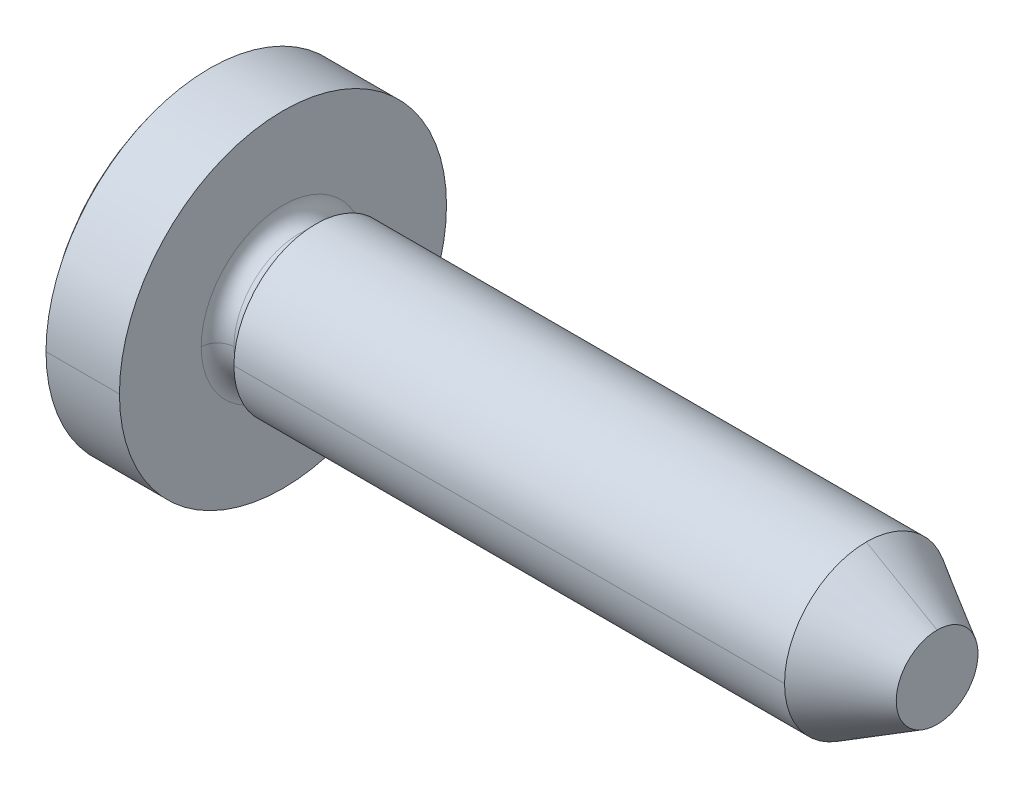
ISO-10303-21;
HEADER;
FILE_DESCRIPTION(('STEP AP214'),'2;1');
FILE_NAME('part.step','',(''),(''),'','','');
FILE_SCHEMA(('AUTOMOTIVE_DESIGN { 1 0 10303 214 1 1 1 1 }'));
ENDSEC;
DATA;
#1=APPLICATION_CONTEXT('core data for automotive mechanical design processes');
#2=APPLICATION_PROTOCOL_DEFINITION('international standard','automotive_design',2000,#1);
#3=PRODUCT_CONTEXT('',#1,'mechanical');
#4=PRODUCT('Part','Part','',(#3));
#5=PRODUCT_RELATED_PRODUCT_CATEGORY('part','',(#4));
#6=PRODUCT_DEFINITION_FORMATION('','',#4);
#7=PRODUCT_DEFINITION_CONTEXT('part definition',#1,'design');
#8=PRODUCT_DEFINITION('design','',#6,#7);
#9=PRODUCT_DEFINITION_SHAPE('','',#8);
#10=(LENGTH_UNIT() NAMED_UNIT(*) SI_UNIT(.MILLI.,.METRE.));
#11=(NAMED_UNIT(*) PLANE_ANGLE_UNIT() SI_UNIT($,.RADIAN.));
#12=(NAMED_UNIT(*) SI_UNIT($,.STERADIAN.) SOLID_ANGLE_UNIT());
#13=UNCERTAINTY_MEASURE_WITH_UNIT(LENGTH_MEASURE(1.E-05),#10,'distance_accuracy_value','');
#14=(GEOMETRIC_REPRESENTATION_CONTEXT(3) GLOBAL_UNCERTAINTY_ASSIGNED_CONTEXT((#13)) GLOBAL_UNIT_ASSIGNED_CONTEXT((#10,
#11,#12)) REPRESENTATION_CONTEXT('',''));
#15=CARTESIAN_POINT('',(0.,0.,0.));
#16=DIRECTION('',(0.,0.,1.));
#17=DIRECTION('',(1.,0.,0.));
#18=AXIS2_PLACEMENT_3D('',#15,#16,#17);
#19=CARTESIAN_POINT('',(1.8,0.,0.));
#20=DIRECTION('',(1.,0.,0.));
#21=DIRECTION('',(0.,0.,-1.));
#22=AXIS2_PLACEMENT_3D('',#19,#20,#21);
#23=TOROIDAL_SURFACE('',#22,0.999999999999981,0.2);
#24=CARTESIAN_POINT('',(1.8,0.,-0.999999999999981));
#25=DIRECTION('',(0.,-1.,0.));
#26=DIRECTION('',(0.,0.,-1.));
#27=AXIS2_PLACEMENT_3D('',#24,#25,#26);
#28=CIRCLE('',#27,0.2);
#29=CARTESIAN_POINT('',(2.,0.,-0.999999999999981));
#30=VERTEX_POINT('',#29);
#31=CARTESIAN_POINT('',(1.8,0.,-0.799999999999981));
#32=VERTEX_POINT('',#31);
#33=EDGE_CURVE('E11',#30,#32,#28,.T.);
#34=ORIENTED_EDGE('',*,*,#33,.T.);
#35=CARTESIAN_POINT('',(1.8,0.,0.));
#36=DIRECTION('',(1.,0.,0.));
#37=DIRECTION('',(0.,0.,-1.));
#38=AXIS2_PLACEMENT_3D('',#35,#36,#37);
#39=CIRCLE('',#38,0.799999999999981);
#40=CARTESIAN_POINT('',(1.8,0.,0.799999999999981));
#41=VERTEX_POINT('',#40);
#42=EDGE_CURVE('E27',#32,#41,#39,.T.);
#43=ORIENTED_EDGE('',*,*,#42,.T.);
#44=CARTESIAN_POINT('',(1.8,0.,0.999999999999981));
#45=DIRECTION('',(0.,1.,0.));
#46=DIRECTION('',(0.,0.,1.));
#47=AXIS2_PLACEMENT_3D('',#44,#45,#46);
#48=CIRCLE('',#47,0.2);
#49=CARTESIAN_POINT('',(2.,0.,0.999999999999981));
#50=VERTEX_POINT('',#49);
#51=EDGE_CURVE('E372',#50,#41,#48,.T.);
#52=ORIENTED_EDGE('',*,*,#51,.F.);
#53=CARTESIAN_POINT('',(2.,0.,0.));
#54=DIRECTION('',(1.,0.,0.));
#55=DIRECTION('',(0.,0.,-1.));
#56=AXIS2_PLACEMENT_3D('',#53,#54,#55);
#57=CIRCLE('',#56,0.999999999999981);
#58=EDGE_CURVE('E326',#30,#50,#57,.T.);
#59=ORIENTED_EDGE('',*,*,#58,.F.);
#60=EDGE_LOOP('',(#34,#43,#52,#59));
#61=FACE_BOUND('',#60,.T.);
#62=ADVANCED_FACE('F16',(#61),#23,.F.);
#63=CARTESIAN_POINT('',(1.8,0.,0.));
#64=DIRECTION('',(1.,0.,0.));
#65=DIRECTION('',(0.,0.,-1.));
#66=AXIS2_PLACEMENT_3D('',#63,#64,#65);
#67=TOROIDAL_SURFACE('',#66,0.999999999999981,0.2);
#68=ORIENTED_EDGE('',*,*,#51,.T.);
#69=CARTESIAN_POINT('',(1.8,0.,0.));
#70=DIRECTION('',(1.,0.,0.));
#71=DIRECTION('',(0.,0.,-1.));
#72=AXIS2_PLACEMENT_3D('',#69,#70,#71);
#73=CIRCLE('',#72,0.799999999999981);
#74=EDGE_CURVE('E42',#41,#32,#73,.T.);
#75=ORIENTED_EDGE('',*,*,#74,.T.);
#76=ORIENTED_EDGE('',*,*,#33,.F.);
#77=CARTESIAN_POINT('',(2.,0.,0.));
#78=DIRECTION('',(1.,0.,0.));
#79=DIRECTION('',(0.,0.,-1.));
#80=AXIS2_PLACEMENT_3D('',#77,#78,#79);
#81=CIRCLE('',#80,0.999999999999981);
#82=EDGE_CURVE('E291',#50,#30,#81,.T.);
#83=ORIENTED_EDGE('',*,*,#82,.F.);
#84=EDGE_LOOP('',(#68,#75,#76,#83));
#85=FACE_BOUND('',#84,.T.);
#86=ADVANCED_FACE('F502',(#85),#67,.F.);
#87=CARTESIAN_POINT('',(-96.3851955307263,0.,0.));
#88=DIRECTION('',(-1.,0.,0.));
#89=DIRECTION('',(0.,0.,1.));
#90=AXIS2_PLACEMENT_3D('',#87,#88,#89);
#91=CYLINDRICAL_SURFACE('',#90,0.999999999999984);
#92=CARTESIAN_POINT('',(8.73397459621555,0.,0.));
#93=DIRECTION('',(1.,0.,0.));
#94=DIRECTION('',(0.,1.,0.));
#95=AXIS2_PLACEMENT_3D('',#92,#93,#94);
#96=CIRCLE('',#95,1.);
#97=CARTESIAN_POINT('',(8.73397459621555,0.,-1.));
#98=VERTEX_POINT('',#97);
#99=CARTESIAN_POINT('',(8.73397459621555,1.,0.));
#100=VERTEX_POINT('',#99);
#101=EDGE_CURVE('E290',#98,#100,#96,.T.);
#102=ORIENTED_EDGE('',*,*,#101,.F.);
#103=DIRECTION('',(-1.,0.,0.));
#104=VECTOR('',#103,1.);
#105=CARTESIAN_POINT('',(-96.3851955307263,0.,-0.999999999999984));
#106=LINE('',#105,#104);
#107=EDGE_CURVE('E330',#98,#30,#106,.T.);
#108=ORIENTED_EDGE('',*,*,#107,.T.);
#109=ORIENTED_EDGE('',*,*,#58,.T.);
#110=DIRECTION('',(-1.,0.,0.));
#111=VECTOR('',#110,1.);
#112=CARTESIAN_POINT('',(-96.3851955307263,0.,0.999999999999984));
#113=LINE('',#112,#111);
#114=CARTESIAN_POINT('',(8.73397459621555,0.,1.));
#115=VERTEX_POINT('',#114);
#116=EDGE_CURVE('E286',#115,#50,#113,.T.);
#117=ORIENTED_EDGE('',*,*,#116,.F.);
#118=CARTESIAN_POINT('',(8.73397459621555,0.,0.));
#119=DIRECTION('',(1.,0.,0.));
#120=DIRECTION('',(0.,1.,0.));
#121=AXIS2_PLACEMENT_3D('',#118,#119,#120);
#122=CIRCLE('',#121,1.);
#123=EDGE_CURVE('E438',#100,#115,#122,.T.);
#124=ORIENTED_EDGE('',*,*,#123,.F.);
#125=EDGE_LOOP('',(#102,#108,#109,#117,#124));
#126=FACE_BOUND('',#125,.T.);
#127=ADVANCED_FACE('F483',(#126),#91,.T.);
#128=CARTESIAN_POINT('',(9.6,0.,0.));
#129=DIRECTION('',(-1.,0.,0.));
#130=DIRECTION('',(0.,-1.,0.));
#131=AXIS2_PLACEMENT_3D('',#128,#129,#130);
#132=CONICAL_SURFACE('',#131,0.5,0.523598775598297);
#133=CARTESIAN_POINT('',(9.6,0.,0.));
#134=DIRECTION('',(1.,0.,0.));
#135=DIRECTION('',(0.,1.,0.));
#136=AXIS2_PLACEMENT_3D('',#133,#134,#135);
#137=CIRCLE('',#136,0.5);
#138=CARTESIAN_POINT('',(9.6,0.5,0.));
#139=VERTEX_POINT('',#138);
#140=CARTESIAN_POINT('',(9.6,-0.5,0.));
#141=VERTEX_POINT('',#140);
#142=EDGE_CURVE('E369',#139,#141,#137,.T.);
#143=ORIENTED_EDGE('',*,*,#142,.F.);
#144=DIRECTION('',(-0.866025403784442,0.5,0.));
#145=VECTOR('',#144,1.);
#146=CARTESIAN_POINT('',(9.6,0.5,0.));
#147=LINE('',#146,#145);
#148=EDGE_CURVE('E331',#139,#100,#147,.T.);
#149=ORIENTED_EDGE('',*,*,#148,.T.);
#150=ORIENTED_EDGE('',*,*,#123,.T.);
#151=CARTESIAN_POINT('',(8.73397459621555,0.,0.));
#152=DIRECTION('',(1.,0.,0.));
#153=DIRECTION('',(0.,1.,0.));
#154=AXIS2_PLACEMENT_3D('',#151,#152,#153);
#155=CIRCLE('',#154,1.);
#156=CARTESIAN_POINT('',(8.73397459621555,-1.,0.));
#157=VERTEX_POINT('',#156);
#158=EDGE_CURVE('E434',#115,#157,#155,.T.);
#159=ORIENTED_EDGE('',*,*,#158,.T.);
#160=DIRECTION('',(-0.866025403784441,-0.5,0.));
#161=VECTOR('',#160,1.);
#162=CARTESIAN_POINT('',(9.6,-0.5,0.));
#163=LINE('',#162,#161);
#164=EDGE_CURVE('E386',#141,#157,#163,.T.);
#165=ORIENTED_EDGE('',*,*,#164,.F.);
#166=EDGE_LOOP('',(#143,#149,#150,#159,#165));
#167=FACE_BOUND('',#166,.T.);
#168=ADVANCED_FACE('F476',(#167),#132,.T.);
#169=CARTESIAN_POINT('',(1.8,0.,0.));
#170=DIRECTION('',(1.,0.,0.));
#171=DIRECTION('',(0.,0.,-1.));
#172=AXIS2_PLACEMENT_3D('',#169,#170,#171);
#173=TOROIDAL_SURFACE('',#172,0.999999999999981,0.2);
#174=ORIENTED_EDGE('',*,*,#74,.F.);
#175=CARTESIAN_POINT('',(1.8,0.,0.999999999999981));
#176=DIRECTION('',(0.,1.,0.));
#177=DIRECTION('',(0.,0.,1.));
#178=AXIS2_PLACEMENT_3D('',#175,#176,#177);
#179=CIRCLE('',#178,0.2);
#180=CARTESIAN_POINT('',(1.6,0.,0.999999999999981));
#181=VERTEX_POINT('',#180);
#182=EDGE_CURVE('E390',#41,#181,#179,.T.);
#183=ORIENTED_EDGE('',*,*,#182,.T.);
#184=CARTESIAN_POINT('',(1.6,0.,0.));
#185=DIRECTION('',(1.,0.,0.));
#186=DIRECTION('',(0.,0.,-1.));
#187=AXIS2_PLACEMENT_3D('',#184,#185,#186);
#188=CIRCLE('',#187,0.999999999999981);
#189=CARTESIAN_POINT('',(1.6,0.,-0.999999999999981));
#190=VERTEX_POINT('',#189);
#191=EDGE_CURVE('E274',#181,#190,#188,.T.);
#192=ORIENTED_EDGE('',*,*,#191,.T.);
#193=CARTESIAN_POINT('',(1.8,0.,-0.999999999999981));
#194=DIRECTION('',(0.,-1.,0.));
#195=DIRECTION('',(0.,0.,-1.));
#196=AXIS2_PLACEMENT_3D('',#193,#194,#195);
#197=CIRCLE('',#196,0.2);
#198=EDGE_CURVE('E296',#32,#190,#197,.T.);
#199=ORIENTED_EDGE('',*,*,#198,.F.);
#200=EDGE_LOOP('',(#174,#183,#192,#199));
#201=FACE_BOUND('',#200,.T.);
#202=ADVANCED_FACE('F680',(#201),#173,.F.);
#203=CARTESIAN_POINT('',(-96.3851955307263,0.,0.));
#204=DIRECTION('',(-1.,0.,0.));
#205=DIRECTION('',(0.,0.,1.));
#206=AXIS2_PLACEMENT_3D('',#203,#204,#205);
#207=CYLINDRICAL_SURFACE('',#206,2.);
#208=CARTESIAN_POINT('',(1.6,0.,0.));
#209=DIRECTION('',(-1.,0.,0.));
#210=DIRECTION('',(0.,0.,1.));
#211=AXIS2_PLACEMENT_3D('',#208,#209,#210);
#212=CIRCLE('',#211,2.);
#213=CARTESIAN_POINT('',(1.6,0.,2.));
#214=VERTEX_POINT('',#213);
#215=CARTESIAN_POINT('',(1.6,0.,-2.));
#216=VERTEX_POINT('',#215);
#217=EDGE_CURVE('E271',#214,#216,#212,.T.);
#218=ORIENTED_EDGE('',*,*,#217,.T.);
#219=DIRECTION('',(-1.,0.,0.));
#220=VECTOR('',#219,1.);
#221=CARTESIAN_POINT('',(-96.3851955307263,0.,-2.));
#222=LINE('',#221,#220);
#223=CARTESIAN_POINT('',(0.702000800640645,0.,-2.));
#224=VERTEX_POINT('',#223);
#225=EDGE_CURVE('E275',#216,#224,#222,.T.);
#226=ORIENTED_EDGE('',*,*,#225,.T.);
#227=CARTESIAN_POINT('',(0.702000800640645,0.,0.));
#228=DIRECTION('',(-1.,0.,0.));
#229=DIRECTION('',(0.,0.,1.));
#230=AXIS2_PLACEMENT_3D('',#227,#228,#229);
#231=CIRCLE('',#230,2.);
#232=CARTESIAN_POINT('',(0.702000800640646,2.,0.));
#233=VERTEX_POINT('',#232);
#234=EDGE_CURVE('E158',#233,#224,#231,.T.);
#235=ORIENTED_EDGE('',*,*,#234,.F.);
#236=CARTESIAN_POINT('',(0.702000800640645,0.,0.));
#237=DIRECTION('',(-1.,0.,0.));
#238=DIRECTION('',(0.,0.,1.));
#239=AXIS2_PLACEMENT_3D('',#236,#237,#238);
#240=CIRCLE('',#239,2.);
#241=CARTESIAN_POINT('',(0.702000800640645,0.,2.));
#242=VERTEX_POINT('',#241);
#243=EDGE_CURVE('E172',#242,#233,#240,.T.);
#244=ORIENTED_EDGE('',*,*,#243,.F.);
#245=DIRECTION('',(-1.,0.,0.));
#246=VECTOR('',#245,1.);
#247=CARTESIAN_POINT('',(-96.3851955307263,0.,2.));
#248=LINE('',#247,#246);
#249=EDGE_CURVE('E303',#214,#242,#248,.T.);
#250=ORIENTED_EDGE('',*,*,#249,.F.);
#251=EDGE_LOOP('',(#218,#226,#235,#244,#250));
#252=FACE_BOUND('',#251,.T.);
#253=ADVANCED_FACE('F894',(#252),#207,.T.);
#254=CARTESIAN_POINT('',(3.2,0.,0.));
#255=DIRECTION('',(0.,0.,-1.));
#256=DIRECTION('',(0.,1.,0.));
#257=AXIS2_PLACEMENT_3D('',#254,#255,#256);
#258=SPHERICAL_SURFACE('',#257,3.2);
#259=ORIENTED_EDGE('',*,*,#234,.T.);
#260=CARTESIAN_POINT('',(0.702000800640645,0.,0.));
#261=DIRECTION('',(-1.,0.,0.));
#262=DIRECTION('',(0.,0.,1.));
#263=AXIS2_PLACEMENT_3D('',#260,#261,#262);
#264=CIRCLE('',#263,2.);
#265=CARTESIAN_POINT('',(0.702000800640646,-2.,0.));
#266=VERTEX_POINT('',#265);
#267=EDGE_CURVE('E355',#224,#266,#264,.T.);
#268=ORIENTED_EDGE('',*,*,#267,.T.);
#269=CARTESIAN_POINT('',(3.2,0.,0.));
#270=DIRECTION('',(0.,0.,-1.));
#271=DIRECTION('',(0.,1.,0.));
#272=AXIS2_PLACEMENT_3D('',#269,#270,#271);
#273=CIRCLE('',#272,3.2);
#274=CARTESIAN_POINT('',(0.123076056971172,-0.878942005376896,0.));
#275=VERTEX_POINT('',#274);
#276=EDGE_CURVE('E358',#266,#275,#273,.T.);
#277=ORIENTED_EDGE('',*,*,#276,.T.);
#278=CARTESIAN_POINT('',(2.8113620667976,0.673140646055101,0.));
#279=DIRECTION('',(-0.5,0.866025403784438,0.));
#280=DIRECTION('',(-0.866025403784438,-0.5,0.));
#281=AXIS2_PLACEMENT_3D('',#278,#279,#280);
#282=CIRCLE('',#281,3.10416530286399);
#283=CARTESIAN_POINT('',(0.128116518841078,-0.876031893359466,-0.19));
#284=VERTEX_POINT('',#283);
#285=EDGE_CURVE('E284',#284,#275,#282,.T.);
#286=ORIENTED_EDGE('',*,*,#285,.F.);
#287=CARTESIAN_POINT('',(3.2,0.,-0.19));
#288=DIRECTION('',(0.,0.,1.));
#289=DIRECTION('',(1.,0.,0.));
#290=AXIS2_PLACEMENT_3D('',#287,#288,#289);
#291=CIRCLE('',#290,3.19435439486605);
#292=CARTESIAN_POINT('',(0.011301205820781,-0.19,-0.19));
#293=VERTEX_POINT('',#292);
#294=EDGE_CURVE('E418',#293,#284,#291,.T.);
#295=ORIENTED_EDGE('',*,*,#294,.F.);
#296=CARTESIAN_POINT('',(3.2,-0.19,0.));
#297=DIRECTION('',(0.,1.,0.));
#298=DIRECTION('',(0.,0.,1.));
#299=AXIS2_PLACEMENT_3D('',#296,#297,#298);
#300=CIRCLE('',#299,3.19435439486605);
#301=CARTESIAN_POINT('',(0.128116518841081,-0.19,-0.876031893359465));
#302=VERTEX_POINT('',#301);
#303=EDGE_CURVE('E276',#302,#293,#300,.T.);
#304=ORIENTED_EDGE('',*,*,#303,.F.);
#305=CARTESIAN_POINT('',(2.81136206679761,0.,0.673140646055104));
#306=DIRECTION('',(-0.5,0.,0.866025403784438));
#307=DIRECTION('',(0.866025403784438,0.,0.5));
#308=AXIS2_PLACEMENT_3D('',#305,#306,#307);
#309=CIRCLE('',#308,3.10416530286399);
#310=CARTESIAN_POINT('',(0.128116518841083,0.19,-0.876031893359464));
#311=VERTEX_POINT('',#310);
#312=EDGE_CURVE('E332',#311,#302,#309,.T.);
#313=ORIENTED_EDGE('',*,*,#312,.F.);
#314=CARTESIAN_POINT('',(3.2,0.19,0.));
#315=DIRECTION('',(0.,-1.,0.));
#316=DIRECTION('',(0.,0.,-1.));
#317=AXIS2_PLACEMENT_3D('',#314,#315,#316);
#318=CIRCLE('',#317,3.19435439486604);
#319=CARTESIAN_POINT('',(0.0113012058207827,0.19,-0.19));
#320=VERTEX_POINT('',#319);
#321=EDGE_CURVE('E322',#320,#311,#318,.T.);
#322=ORIENTED_EDGE('',*,*,#321,.F.);
#323=CARTESIAN_POINT('',(3.2,0.,-0.19));
#324=DIRECTION('',(0.,0.,1.));
#325=DIRECTION('',(0.,-1.,0.));
#326=AXIS2_PLACEMENT_3D('',#323,#324,#325);
#327=CIRCLE('',#326,3.19435439486604);
#328=CARTESIAN_POINT('',(0.128116518841085,0.87603189335946,-0.19));
#329=VERTEX_POINT('',#328);
#330=EDGE_CURVE('E344',#329,#320,#327,.T.);
#331=ORIENTED_EDGE('',*,*,#330,.F.);
#332=CARTESIAN_POINT('',(2.81136206679761,-0.67314064605511,0.));
#333=DIRECTION('',(-0.5,-0.866025403784438,0.));
#334=DIRECTION('',(0.866025403784438,-0.5,0.));
#335=AXIS2_PLACEMENT_3D('',#332,#333,#334);
#336=CIRCLE('',#335,3.10416530286399);
#337=CARTESIAN_POINT('',(0.123076056971179,0.87894200537689,0.));
#338=VERTEX_POINT('',#337);
#339=EDGE_CURVE('E253',#338,#329,#336,.T.);
#340=ORIENTED_EDGE('',*,*,#339,.F.);
#341=CARTESIAN_POINT('',(3.2,0.,0.));
#342=DIRECTION('',(0.,0.,1.));
#343=DIRECTION('',(1.,0.,0.));
#344=AXIS2_PLACEMENT_3D('',#341,#342,#343);
#345=CIRCLE('',#344,3.2);
#346=EDGE_CURVE('E249',#233,#338,#345,.T.);
#347=ORIENTED_EDGE('',*,*,#346,.F.);
#348=EDGE_LOOP('',(#259,#268,#277,#286,#295,#304,#313,#322,#331,#340,#347));
#349=FACE_BOUND('',#348,.T.);
#350=ADVANCED_FACE('F539',(#349),#258,.T.);
#351=CARTESIAN_POINT('',(3.2,0.,0.));
#352=DIRECTION('',(0.,0.,-1.));
#353=DIRECTION('',(0.,1.,0.));
#354=AXIS2_PLACEMENT_3D('',#351,#352,#353);
#355=SPHERICAL_SURFACE('',#354,3.2);
#356=ORIENTED_EDGE('',*,*,#276,.F.);
#357=CARTESIAN_POINT('',(0.702000800640645,0.,0.));
#358=DIRECTION('',(-1.,0.,0.));
#359=DIRECTION('',(0.,0.,1.));
#360=AXIS2_PLACEMENT_3D('',#357,#358,#359);
#361=CIRCLE('',#360,2.);
#362=EDGE_CURVE('E421',#266,#242,#361,.T.);
#363=ORIENTED_EDGE('',*,*,#362,.T.);
#364=ORIENTED_EDGE('',*,*,#243,.T.);
#365=ORIENTED_EDGE('',*,*,#346,.T.);
#366=CARTESIAN_POINT('',(2.81136206679761,-0.67314064605511,0.));
#367=DIRECTION('',(-0.5,-0.866025403784438,0.));
#368=DIRECTION('',(0.866025403784438,-0.5,0.));
#369=AXIS2_PLACEMENT_3D('',#366,#367,#368);
#370=CIRCLE('',#369,3.10416530286399);
#371=CARTESIAN_POINT('',(0.128116518841086,0.87603189335946,0.19));
#372=VERTEX_POINT('',#371);
#373=EDGE_CURVE('E247',#372,#338,#370,.T.);
#374=ORIENTED_EDGE('',*,*,#373,.F.);
#375=CARTESIAN_POINT('',(3.2,0.,0.19));
#376=DIRECTION('',(0.,0.,-1.));
#377=DIRECTION('',(0.,1.,0.));
#378=AXIS2_PLACEMENT_3D('',#375,#376,#377);
#379=CIRCLE('',#378,3.19435439486604);
#380=CARTESIAN_POINT('',(0.0113012058207827,0.19,0.19));
#381=VERTEX_POINT('',#380);
#382=EDGE_CURVE('E234',#381,#372,#379,.T.);
#383=ORIENTED_EDGE('',*,*,#382,.F.);
#384=CARTESIAN_POINT('',(3.2,0.19,0.));
#385=DIRECTION('',(0.,-1.,0.));
#386=DIRECTION('',(0.,0.,-1.));
#387=AXIS2_PLACEMENT_3D('',#384,#385,#386);
#388=CIRCLE('',#387,3.19435439486604);
#389=CARTESIAN_POINT('',(0.128116518841082,0.19,0.876031893359463));
#390=VERTEX_POINT('',#389);
#391=EDGE_CURVE('E308',#390,#381,#388,.T.);
#392=ORIENTED_EDGE('',*,*,#391,.F.);
#393=CARTESIAN_POINT('',(2.81136206679761,0.,-0.673140646055105));
#394=DIRECTION('',(-0.5,0.,-0.866025403784438));
#395=DIRECTION('',(-0.866025403784438,0.,0.5));
#396=AXIS2_PLACEMENT_3D('',#393,#394,#395);
#397=CIRCLE('',#396,3.10416530286399);
#398=CARTESIAN_POINT('',(0.128116518841081,-0.19,0.876031893359464));
#399=VERTEX_POINT('',#398);
#400=EDGE_CURVE('E314',#399,#390,#397,.T.);
#401=ORIENTED_EDGE('',*,*,#400,.F.);
#402=CARTESIAN_POINT('',(3.2,-0.19,0.));
#403=DIRECTION('',(0.,1.,0.));
#404=DIRECTION('',(0.,0.,1.));
#405=AXIS2_PLACEMENT_3D('',#402,#403,#404);
#406=CIRCLE('',#405,3.19435439486605);
#407=CARTESIAN_POINT('',(0.011301205820781,-0.19,0.19));
#408=VERTEX_POINT('',#407);
#409=EDGE_CURVE('E269',#408,#399,#406,.T.);
#410=ORIENTED_EDGE('',*,*,#409,.F.);
#411=CARTESIAN_POINT('',(3.2,0.,0.19));
#412=DIRECTION('',(0.,0.,-1.));
#413=DIRECTION('',(0.,1.,0.));
#414=AXIS2_PLACEMENT_3D('',#411,#412,#413);
#415=CIRCLE('',#414,3.19435439486604);
#416=CARTESIAN_POINT('',(0.128116518841078,-0.876031893359466,0.19));
#417=VERTEX_POINT('',#416);
#418=EDGE_CURVE('E321',#417,#408,#415,.T.);
#419=ORIENTED_EDGE('',*,*,#418,.F.);
#420=CARTESIAN_POINT('',(2.8113620667976,0.673140646055101,0.));
#421=DIRECTION('',(-0.5,0.866025403784438,0.));
#422=DIRECTION('',(-0.866025403784438,-0.5,0.));
#423=AXIS2_PLACEMENT_3D('',#420,#421,#422);
#424=CIRCLE('',#423,3.10416530286399);
#425=EDGE_CURVE('E281',#275,#417,#424,.T.);
#426=ORIENTED_EDGE('',*,*,#425,.F.);
#427=EDGE_LOOP('',(#356,#363,#364,#365,#374,#383,#392,#401,#410,#419,#426));
#428=FACE_BOUND('',#427,.T.);
#429=ADVANCED_FACE('F248',(#428),#355,.T.);
#430=CARTESIAN_POINT('',(1.6,0.999999999999981,0.));
#431=DIRECTION('',(-1.,0.,0.));
#432=DIRECTION('',(0.,0.,1.));
#433=AXIS2_PLACEMENT_3D('',#430,#431,#432);
#434=PLANE('',#433);
#435=ORIENTED_EDGE('',*,*,#217,.F.);
#436=CARTESIAN_POINT('',(1.6,0.,0.));
#437=DIRECTION('',(-1.,0.,0.));
#438=DIRECTION('',(0.,0.,1.));
#439=AXIS2_PLACEMENT_3D('',#436,#437,#438);
#440=CIRCLE('',#439,2.);
#441=EDGE_CURVE('E299',#216,#214,#440,.T.);
#442=ORIENTED_EDGE('',*,*,#441,.F.);
#443=EDGE_LOOP('',(#435,#442));
#444=FACE_BOUND('',#443,.T.);
#445=CARTESIAN_POINT('',(1.6,0.,0.));
#446=DIRECTION('',(1.,0.,0.));
#447=DIRECTION('',(0.,0.,-1.));
#448=AXIS2_PLACEMENT_3D('',#445,#446,#447);
#449=CIRCLE('',#448,0.999999999999981);
#450=EDGE_CURVE('E337',#190,#181,#449,.T.);
#451=ORIENTED_EDGE('',*,*,#450,.F.);
#452=ORIENTED_EDGE('',*,*,#191,.F.);
#453=EDGE_LOOP('',(#451,#452));
#454=FACE_BOUND('',#453,.T.);
#455=ADVANCED_FACE('F515',(#444,#454),#434,.F.);
#456=CARTESIAN_POINT('',(-96.3851955307263,0.,0.));
#457=DIRECTION('',(-1.,0.,0.));
#458=DIRECTION('',(0.,0.,1.));
#459=AXIS2_PLACEMENT_3D('',#456,#457,#458);
#460=CYLINDRICAL_SURFACE('',#459,2.);
#461=ORIENTED_EDGE('',*,*,#225,.F.);
#462=ORIENTED_EDGE('',*,*,#441,.T.);
#463=ORIENTED_EDGE('',*,*,#249,.T.);
#464=ORIENTED_EDGE('',*,*,#362,.F.);
#465=ORIENTED_EDGE('',*,*,#267,.F.);
#466=EDGE_LOOP('',(#461,#462,#463,#464,#465));
#467=FACE_BOUND('',#466,.T.);
#468=ADVANCED_FACE('F512',(#467),#460,.T.);
#469=CARTESIAN_POINT('',(0.9,0.95,-0.19));
#470=DIRECTION('',(0.,0.,1.));
#471=DIRECTION('',(0.,-1.,0.));
#472=AXIS2_PLACEMENT_3D('',#469,#470,#471);
#473=PLANE('',#472);
#474=ORIENTED_EDGE('',*,*,#330,.T.);
#475=DIRECTION('',(-1.,0.,0.));
#476=VECTOR('',#475,1.);
#477=CARTESIAN_POINT('',(0.9,0.19,-0.19));
#478=LINE('',#477,#476);
#479=CARTESIAN_POINT('',(0.9,0.19,-0.19));
#480=VERTEX_POINT('',#479);
#481=EDGE_CURVE('E292',#480,#320,#478,.T.);
#482=ORIENTED_EDGE('',*,*,#481,.F.);
#483=DIRECTION('',(0.,1.,0.));
#484=VECTOR('',#483,1.);
#485=CARTESIAN_POINT('',(0.9,0.95,-0.19));
#486=LINE('',#485,#484);
#487=CARTESIAN_POINT('',(0.9,0.430384757729334,-0.19));
#488=VERTEX_POINT('',#487);
#489=EDGE_CURVE('E348',#480,#488,#486,.T.);
#490=ORIENTED_EDGE('',*,*,#489,.T.);
#491=DIRECTION('',(-0.866025403784438,0.5,0.));
#492=VECTOR('',#491,1.);
#493=CARTESIAN_POINT('',(0.,0.95,-0.19));
#494=LINE('',#493,#492);
#495=EDGE_CURVE('E252',#488,#329,#494,.T.);
#496=ORIENTED_EDGE('',*,*,#495,.T.);
#497=EDGE_LOOP('',(#474,#482,#490,#496));
#498=FACE_BOUND('',#497,.T.);
#499=ADVANCED_FACE('F18',(#498),#473,.T.);
#500=CARTESIAN_POINT('',(0.,0.95,0.));
#501=DIRECTION('',(-0.5,-0.866025403784438,0.));
#502=DIRECTION('',(-0.866025403784438,0.5,0.));
#503=AXIS2_PLACEMENT_3D('',#500,#501,#502);
#504=PLANE('',#503);
#505=ORIENTED_EDGE('',*,*,#373,.T.);
#506=ORIENTED_EDGE('',*,*,#339,.T.);
#507=ORIENTED_EDGE('',*,*,#495,.F.);
#508=DIRECTION('',(0.,0.,1.));
#509=VECTOR('',#508,1.);
#510=CARTESIAN_POINT('',(0.9,0.430384757729334,-0.19));
#511=LINE('',#510,#509);
#512=CARTESIAN_POINT('',(0.9,0.430384757729334,0.19));
#513=VERTEX_POINT('',#512);
#514=EDGE_CURVE('E257',#488,#513,#511,.T.);
#515=ORIENTED_EDGE('',*,*,#514,.T.);
#516=DIRECTION('',(-0.866025403784438,0.5,0.));
#517=VECTOR('',#516,1.);
#518=CARTESIAN_POINT('',(0.675,0.560288568297001,0.19));
#519=LINE('',#518,#517);
#520=EDGE_CURVE('E239',#513,#372,#519,.T.);
#521=ORIENTED_EDGE('',*,*,#520,.T.);
#522=EDGE_LOOP('',(#505,#506,#507,#515,#521));
#523=FACE_BOUND('',#522,.T.);
#524=ADVANCED_FACE('F255',(#523),#504,.T.);
#525=CARTESIAN_POINT('',(0.9,0.95,0.19));
#526=DIRECTION('',(0.,0.,-1.));
#527=DIRECTION('',(-1.,0.,0.));
#528=AXIS2_PLACEMENT_3D('',#525,#526,#527);
#529=PLANE('',#528);
#530=ORIENTED_EDGE('',*,*,#382,.T.);
#531=ORIENTED_EDGE('',*,*,#520,.F.);
#532=DIRECTION('',(0.,-1.,0.));
#533=VECTOR('',#532,1.);
#534=CARTESIAN_POINT('',(0.9,0.95,0.19));
#535=LINE('',#534,#533);
#536=CARTESIAN_POINT('',(0.9,0.19,0.19));
#537=VERTEX_POINT('',#536);
#538=EDGE_CURVE('E244',#513,#537,#535,.T.);
#539=ORIENTED_EDGE('',*,*,#538,.T.);
#540=DIRECTION('',(-1.,0.,0.));
#541=VECTOR('',#540,1.);
#542=CARTESIAN_POINT('',(0.9,0.19,0.19));
#543=LINE('',#542,#541);
#544=EDGE_CURVE('E241',#537,#381,#543,.T.);
#545=ORIENTED_EDGE('',*,*,#544,.T.);
#546=EDGE_LOOP('',(#530,#531,#539,#545));
#547=FACE_BOUND('',#546,.T.);
#548=ADVANCED_FACE('F236',(#547),#529,.T.);
#549=CARTESIAN_POINT('',(0.9,0.19,0.19));
#550=DIRECTION('',(0.,-1.,0.));
#551=DIRECTION('',(0.,0.,-1.));
#552=AXIS2_PLACEMENT_3D('',#549,#550,#551);
#553=PLANE('',#552);
#554=ORIENTED_EDGE('',*,*,#391,.T.);
#555=ORIENTED_EDGE('',*,*,#544,.F.);
#556=DIRECTION('',(0.,0.,1.));
#557=VECTOR('',#556,1.);
#558=CARTESIAN_POINT('',(0.9,0.19,0.19));
#559=LINE('',#558,#557);
#560=CARTESIAN_POINT('',(0.9,0.19,0.430384757729335));
#561=VERTEX_POINT('',#560);
#562=EDGE_CURVE('E304',#537,#561,#559,.T.);
#563=ORIENTED_EDGE('',*,*,#562,.T.);
#564=DIRECTION('',(-0.866025403784438,0.,0.5));
#565=VECTOR('',#564,1.);
#566=CARTESIAN_POINT('',(0.,0.19,0.95));
#567=LINE('',#566,#565);
#568=EDGE_CURVE('E309',#561,#390,#567,.T.);
#569=ORIENTED_EDGE('',*,*,#568,.T.);
#570=EDGE_LOOP('',(#554,#555,#563,#569));
#571=FACE_BOUND('',#570,.T.);
#572=ADVANCED_FACE('F975',(#571),#553,.T.);
#573=CARTESIAN_POINT('',(0.,0.,0.95));
#574=DIRECTION('',(-0.5,0.,-0.866025403784438));
#575=DIRECTION('',(-0.866025403784438,0.,0.5));
#576=AXIS2_PLACEMENT_3D('',#573,#574,#575);
#577=PLANE('',#576);
#578=ORIENTED_EDGE('',*,*,#400,.T.);
#579=ORIENTED_EDGE('',*,*,#568,.F.);
#580=DIRECTION('',(0.,-1.,0.));
#581=VECTOR('',#580,1.);
#582=CARTESIAN_POINT('',(0.9,0.19,0.430384757729335));
#583=LINE('',#582,#581);
#584=CARTESIAN_POINT('',(0.9,-0.19,0.430384757729335));
#585=VERTEX_POINT('',#584);
#586=EDGE_CURVE('E310',#561,#585,#583,.T.);
#587=ORIENTED_EDGE('',*,*,#586,.T.);
#588=DIRECTION('',(-0.866025403784438,0.,0.5));
#589=VECTOR('',#588,1.);
#590=CARTESIAN_POINT('',(1.00408965343809,-0.19,0.370288568297));
#591=LINE('',#590,#589);
#592=EDGE_CURVE('E315',#585,#399,#591,.T.);
#593=ORIENTED_EDGE('',*,*,#592,.T.);
#594=EDGE_LOOP('',(#578,#579,#587,#593));
#595=FACE_BOUND('',#594,.T.);
#596=ADVANCED_FACE('F584',(#595),#577,.T.);
#597=CARTESIAN_POINT('',(0.9,-0.19,0.19));
#598=DIRECTION('',(0.,1.,0.));
#599=DIRECTION('',(0.,0.,-1.));
#600=AXIS2_PLACEMENT_3D('',#597,#598,#599);
#601=PLANE('',#600);
#602=ORIENTED_EDGE('',*,*,#409,.T.);
#603=ORIENTED_EDGE('',*,*,#592,.F.);
#604=DIRECTION('',(0.,0.,-1.));
#605=VECTOR('',#604,1.);
#606=CARTESIAN_POINT('',(0.9,-0.19,0.19));
#607=LINE('',#606,#605);
#608=CARTESIAN_POINT('',(0.9,-0.19,0.19));
#609=VERTEX_POINT('',#608);
#610=EDGE_CURVE('E316',#585,#609,#607,.T.);
#611=ORIENTED_EDGE('',*,*,#610,.T.);
#612=DIRECTION('',(-1.,0.,0.));
#613=VECTOR('',#612,1.);
#614=CARTESIAN_POINT('',(0.9,-0.19,0.19));
#615=LINE('',#614,#613);
#616=EDGE_CURVE('E127',#609,#408,#615,.T.);
#617=ORIENTED_EDGE('',*,*,#616,.T.);
#618=EDGE_LOOP('',(#602,#603,#611,#617));
#619=FACE_BOUND('',#618,.T.);
#620=ADVANCED_FACE('F532',(#619),#601,.T.);
#621=CARTESIAN_POINT('',(0.9,-0.95,0.19));
#622=DIRECTION('',(0.,0.,-1.));
#623=DIRECTION('',(-1.,0.,0.));
#624=AXIS2_PLACEMENT_3D('',#621,#622,#623);
#625=PLANE('',#624);
#626=ORIENTED_EDGE('',*,*,#418,.T.);
#627=ORIENTED_EDGE('',*,*,#616,.F.);
#628=DIRECTION('',(0.,-1.,0.));
#629=VECTOR('',#628,1.);
#630=CARTESIAN_POINT('',(0.9,-0.95,0.19));
#631=LINE('',#630,#629);
#632=CARTESIAN_POINT('',(0.9,-0.430384757729336,0.19));
#633=VERTEX_POINT('',#632);
#634=EDGE_CURVE('E424',#609,#633,#631,.T.);
#635=ORIENTED_EDGE('',*,*,#634,.T.);
#636=DIRECTION('',(-0.866025403784438,-0.5,0.));
#637=VECTOR('',#636,1.);
#638=CARTESIAN_POINT('',(0.,-0.95,0.19));
#639=LINE('',#638,#637);
#640=EDGE_CURVE('E115',#633,#417,#639,.T.);
#641=ORIENTED_EDGE('',*,*,#640,.T.);
#642=EDGE_LOOP('',(#626,#627,#635,#641));
#643=FACE_BOUND('',#642,.T.);
#644=ADVANCED_FACE('F524',(#643),#625,.T.);
#645=CARTESIAN_POINT('',(0.,-0.95,0.));
#646=DIRECTION('',(-0.5,0.866025403784438,0.));
#647=DIRECTION('',(0.,0.,1.));
#648=AXIS2_PLACEMENT_3D('',#645,#646,#647);
#649=PLANE('',#648);
#650=ORIENTED_EDGE('',*,*,#285,.T.);
#651=ORIENTED_EDGE('',*,*,#425,.T.);
#652=ORIENTED_EDGE('',*,*,#640,.F.);
#653=DIRECTION('',(0.,0.,-1.));
#654=VECTOR('',#653,1.);
#655=CARTESIAN_POINT('',(0.9,-0.430384757729336,-0.19));
#656=LINE('',#655,#654);
#657=CARTESIAN_POINT('',(0.9,-0.430384757729335,-0.19));
#658=VERTEX_POINT('',#657);
#659=EDGE_CURVE('E285',#633,#658,#656,.T.);
#660=ORIENTED_EDGE('',*,*,#659,.T.);
#661=DIRECTION('',(-0.866025403784438,-0.5,0.));
#662=VECTOR('',#661,1.);
#663=CARTESIAN_POINT('',(0.675,-0.560288568297002,-0.19));
#664=LINE('',#663,#662);
#665=EDGE_CURVE('E414',#658,#284,#664,.T.);
#666=ORIENTED_EDGE('',*,*,#665,.T.);
#667=EDGE_LOOP('',(#650,#651,#652,#660,#666));
#668=FACE_BOUND('',#667,.T.);
#669=ADVANCED_FACE('F521',(#668),#649,.T.);
#670=CARTESIAN_POINT('',(0.9,-0.95,-0.19));
#671=DIRECTION('',(0.,0.,1.));
#672=DIRECTION('',(1.,0.,0.));
#673=AXIS2_PLACEMENT_3D('',#670,#671,#672);
#674=PLANE('',#673);
#675=ORIENTED_EDGE('',*,*,#294,.T.);
#676=ORIENTED_EDGE('',*,*,#665,.F.);
#677=DIRECTION('',(0.,1.,0.));
#678=VECTOR('',#677,1.);
#679=CARTESIAN_POINT('',(0.9,-0.95,-0.19));
#680=LINE('',#679,#678);
#681=CARTESIAN_POINT('',(0.9,-0.19,-0.19));
#682=VERTEX_POINT('',#681);
#683=EDGE_CURVE('E352',#658,#682,#680,.T.);
#684=ORIENTED_EDGE('',*,*,#683,.T.);
#685=DIRECTION('',(-1.,0.,0.));
#686=VECTOR('',#685,1.);
#687=CARTESIAN_POINT('',(0.9,-0.19,-0.19));
#688=LINE('',#687,#686);
#689=EDGE_CURVE('E279',#682,#293,#688,.T.);
#690=ORIENTED_EDGE('',*,*,#689,.T.);
#691=EDGE_LOOP('',(#675,#676,#684,#690));
#692=FACE_BOUND('',#691,.T.);
#693=ADVANCED_FACE('F523',(#692),#674,.T.);
#694=CARTESIAN_POINT('',(0.9,-0.19,-0.19));
#695=DIRECTION('',(0.,1.,0.));
#696=DIRECTION('',(0.,0.,-1.));
#697=AXIS2_PLACEMENT_3D('',#694,#695,#696);
#698=PLANE('',#697);
#699=ORIENTED_EDGE('',*,*,#303,.T.);
#700=ORIENTED_EDGE('',*,*,#689,.F.);
#701=DIRECTION('',(0.,0.,-1.));
#702=VECTOR('',#701,1.);
#703=CARTESIAN_POINT('',(0.9,-0.19,-0.19));
#704=LINE('',#703,#702);
#705=CARTESIAN_POINT('',(0.9,-0.19,-0.430384757729336));
#706=VERTEX_POINT('',#705);
#707=EDGE_CURVE('E280',#682,#706,#704,.T.);
#708=ORIENTED_EDGE('',*,*,#707,.T.);
#709=DIRECTION('',(-0.866025403784438,0.,-0.5));
#710=VECTOR('',#709,1.);
#711=CARTESIAN_POINT('',(0.,-0.19,-0.95));
#712=LINE('',#711,#710);
#713=EDGE_CURVE('E335',#706,#302,#712,.T.);
#714=ORIENTED_EDGE('',*,*,#713,.T.);
#715=EDGE_LOOP('',(#699,#700,#708,#714));
#716=FACE_BOUND('',#715,.T.);
#717=ADVANCED_FACE('F529',(#716),#698,.T.);
#718=CARTESIAN_POINT('',(0.,0.,-0.95));
#719=DIRECTION('',(-0.5,0.,0.866025403784438));
#720=DIRECTION('',(0.,1.,0.));
#721=AXIS2_PLACEMENT_3D('',#718,#719,#720);
#722=PLANE('',#721);
#723=ORIENTED_EDGE('',*,*,#312,.T.);
#724=ORIENTED_EDGE('',*,*,#713,.F.);
#725=DIRECTION('',(0.,1.,0.));
#726=VECTOR('',#725,1.);
#727=CARTESIAN_POINT('',(0.9,0.19,-0.430384757729336));
#728=LINE('',#727,#726);
#729=CARTESIAN_POINT('',(0.9,0.19,-0.430384757729336));
#730=VERTEX_POINT('',#729);
#731=EDGE_CURVE('E336',#706,#730,#728,.T.);
#732=ORIENTED_EDGE('',*,*,#731,.T.);
#733=DIRECTION('',(-0.866025403784438,0.,-0.5));
#734=VECTOR('',#733,1.);
#735=CARTESIAN_POINT('',(1.00408965343809,0.19,-0.370288568297002));
#736=LINE('',#735,#734);
#737=EDGE_CURVE('E325',#730,#311,#736,.T.);
#738=ORIENTED_EDGE('',*,*,#737,.T.);
#739=EDGE_LOOP('',(#723,#724,#732,#738));
#740=FACE_BOUND('',#739,.T.);
#741=ADVANCED_FACE('F559',(#740),#722,.T.);
#742=CARTESIAN_POINT('',(0.9,0.19,-0.19));
#743=DIRECTION('',(0.,-1.,0.));
#744=DIRECTION('',(0.,0.,-1.));
#745=AXIS2_PLACEMENT_3D('',#742,#743,#744);
#746=PLANE('',#745);
#747=ORIENTED_EDGE('',*,*,#321,.T.);
#748=ORIENTED_EDGE('',*,*,#737,.F.);
#749=DIRECTION('',(0.,0.,1.));
#750=VECTOR('',#749,1.);
#751=CARTESIAN_POINT('',(0.9,0.19,-0.19));
#752=LINE('',#751,#750);
#753=EDGE_CURVE('E20',#730,#480,#752,.T.);
#754=ORIENTED_EDGE('',*,*,#753,.T.);
#755=ORIENTED_EDGE('',*,*,#481,.T.);
#756=EDGE_LOOP('',(#747,#748,#754,#755));
#757=FACE_BOUND('',#756,.T.);
#758=ADVANCED_FACE('F570',(#757),#746,.T.);
#759=CARTESIAN_POINT('',(0.9,0.19,-0.19));
#760=DIRECTION('',(-1.,0.,0.));
#761=DIRECTION('',(0.,0.,1.));
#762=AXIS2_PLACEMENT_3D('',#759,#760,#761);
#763=PLANE('',#762);
#764=ORIENTED_EDGE('',*,*,#489,.F.);
#765=ORIENTED_EDGE('',*,*,#753,.F.);
#766=ORIENTED_EDGE('',*,*,#731,.F.);
#767=ORIENTED_EDGE('',*,*,#707,.F.);
#768=ORIENTED_EDGE('',*,*,#683,.F.);
#769=ORIENTED_EDGE('',*,*,#659,.F.);
#770=ORIENTED_EDGE('',*,*,#634,.F.);
#771=ORIENTED_EDGE('',*,*,#610,.F.);
#772=ORIENTED_EDGE('',*,*,#586,.F.);
#773=ORIENTED_EDGE('',*,*,#562,.F.);
#774=ORIENTED_EDGE('',*,*,#538,.F.);
#775=ORIENTED_EDGE('',*,*,#514,.F.);
#776=EDGE_LOOP('',(#764,#765,#766,#767,#768,#769,#770,#771,#772,#773,#774,#775));
#777=FACE_BOUND('',#776,.T.);
#778=ADVANCED_FACE('F496',(#777),#763,.T.);
#779=CARTESIAN_POINT('',(1.8,0.,0.));
#780=DIRECTION('',(1.,0.,0.));
#781=DIRECTION('',(0.,0.,-1.));
#782=AXIS2_PLACEMENT_3D('',#779,#780,#781);
#783=TOROIDAL_SURFACE('',#782,0.999999999999981,0.2);
#784=ORIENTED_EDGE('',*,*,#42,.F.);
#785=ORIENTED_EDGE('',*,*,#198,.T.);
#786=ORIENTED_EDGE('',*,*,#450,.T.);
#787=ORIENTED_EDGE('',*,*,#182,.F.);
#788=EDGE_LOOP('',(#784,#785,#786,#787));
#789=FACE_BOUND('',#788,.T.);
#790=ADVANCED_FACE('F488',(#789),#783,.F.);
#791=CARTESIAN_POINT('',(9.6,0.,0.));
#792=DIRECTION('',(-1.,0.,0.));
#793=DIRECTION('',(0.,0.,1.));
#794=AXIS2_PLACEMENT_3D('',#791,#792,#793);
#795=PLANE('',#794);
#796=CARTESIAN_POINT('',(9.6,0.,0.));
#797=DIRECTION('',(1.,0.,0.));
#798=DIRECTION('',(0.,1.,0.));
#799=AXIS2_PLACEMENT_3D('',#796,#797,#798);
#800=CIRCLE('',#799,0.5);
#801=EDGE_CURVE('E341',#141,#139,#800,.T.);
#802=ORIENTED_EDGE('',*,*,#801,.T.);
#803=ORIENTED_EDGE('',*,*,#142,.T.);
#804=EDGE_LOOP('',(#802,#803));
#805=FACE_BOUND('',#804,.T.);
#806=ADVANCED_FACE('F486',(#805),#795,.F.);
#807=CARTESIAN_POINT('',(9.6,0.,0.));
#808=DIRECTION('',(-1.,0.,0.));
#809=DIRECTION('',(0.,-1.,0.));
#810=AXIS2_PLACEMENT_3D('',#807,#808,#809);
#811=CONICAL_SURFACE('',#810,0.5,0.523598775598297);
#812=ORIENTED_EDGE('',*,*,#148,.F.);
#813=ORIENTED_EDGE('',*,*,#801,.F.);
#814=ORIENTED_EDGE('',*,*,#164,.T.);
#815=CARTESIAN_POINT('',(8.73397459621555,0.,0.));
#816=DIRECTION('',(1.,0.,0.));
#817=DIRECTION('',(0.,1.,0.));
#818=AXIS2_PLACEMENT_3D('',#815,#816,#817);
#819=CIRCLE('',#818,1.);
#820=EDGE_CURVE('E382',#157,#98,#819,.T.);
#821=ORIENTED_EDGE('',*,*,#820,.T.);
#822=ORIENTED_EDGE('',*,*,#101,.T.);
#823=EDGE_LOOP('',(#812,#813,#814,#821,#822));
#824=FACE_BOUND('',#823,.T.);
#825=ADVANCED_FACE('F472',(#824),#811,.T.);
#826=CARTESIAN_POINT('',(-96.3851955307263,0.,0.));
#827=DIRECTION('',(-1.,0.,0.));
#828=DIRECTION('',(0.,0.,1.));
#829=AXIS2_PLACEMENT_3D('',#826,#827,#828);
#830=CYLINDRICAL_SURFACE('',#829,0.999999999999984);
#831=ORIENTED_EDGE('',*,*,#107,.F.);
#832=ORIENTED_EDGE('',*,*,#820,.F.);
#833=ORIENTED_EDGE('',*,*,#158,.F.);
#834=ORIENTED_EDGE('',*,*,#116,.T.);
#835=ORIENTED_EDGE('',*,*,#82,.T.);
#836=EDGE_LOOP('',(#831,#832,#833,#834,#835));
#837=FACE_BOUND('',#836,.T.);
#838=ADVANCED_FACE('F480',(#837),#830,.T.);
#839=CLOSED_SHELL('',(#62,#86,#127,#168,#202,#253,#350,#429,#455,#468,#499,#524,#548,#572,#596,
#620,#644,#669,#693,#717,#741,#758,#778,#790,#806,#825,#838));
#840=MANIFOLD_SOLID_BREP('B1',#839);
#841=ADVANCED_BREP_SHAPE_REPRESENTATION('',(#18,#840),#14);
#842=SHAPE_DEFINITION_REPRESENTATION(#9,#841);
ENDSEC;
END-ISO-10303-21;
